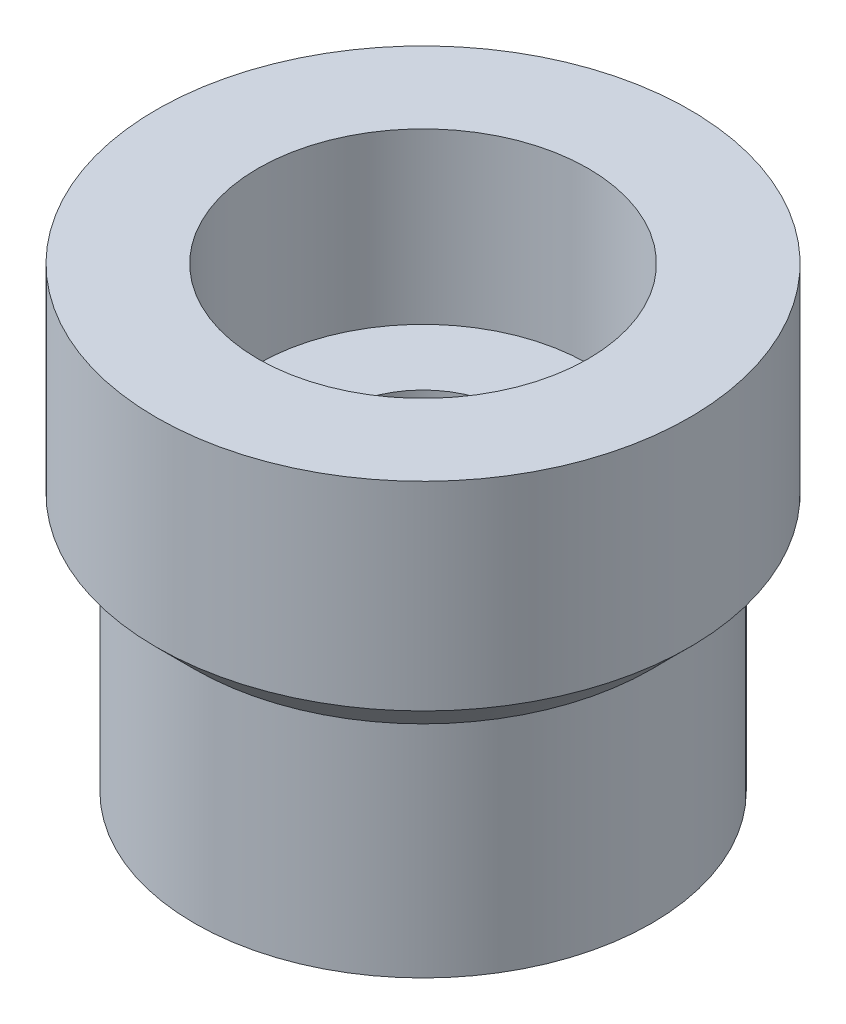
ISO-10303-21;
HEADER;
FILE_DESCRIPTION(('STEP AP214'),'2;1');
FILE_NAME('part.step','',(''),(''),'','','');
FILE_SCHEMA(('AUTOMOTIVE_DESIGN { 1 0 10303 214 1 1 1 1 }'));
ENDSEC;
DATA;
#1=APPLICATION_CONTEXT('core data for automotive mechanical design processes');
#2=APPLICATION_PROTOCOL_DEFINITION('international standard','automotive_design',2000,#1);
#3=PRODUCT_CONTEXT('',#1,'mechanical');
#4=PRODUCT('Part','Part','',(#3));
#5=PRODUCT_RELATED_PRODUCT_CATEGORY('part','',(#4));
#6=PRODUCT_DEFINITION_FORMATION('','',#4);
#7=PRODUCT_DEFINITION_CONTEXT('part definition',#1,'design');
#8=PRODUCT_DEFINITION('design','',#6,#7);
#9=PRODUCT_DEFINITION_SHAPE('','',#8);
#10=(LENGTH_UNIT() NAMED_UNIT(*) SI_UNIT(.MILLI.,.METRE.));
#11=(NAMED_UNIT(*) PLANE_ANGLE_UNIT() SI_UNIT($,.RADIAN.));
#12=(NAMED_UNIT(*) SI_UNIT($,.STERADIAN.) SOLID_ANGLE_UNIT());
#13=UNCERTAINTY_MEASURE_WITH_UNIT(LENGTH_MEASURE(1.E-05),#10,'distance_accuracy_value','');
#14=(GEOMETRIC_REPRESENTATION_CONTEXT(3) GLOBAL_UNCERTAINTY_ASSIGNED_CONTEXT((#13)) GLOBAL_UNIT_ASSIGNED_CONTEXT((#10,
#11,#12)) REPRESENTATION_CONTEXT('',''));
#15=CARTESIAN_POINT('',(0.,0.,0.));
#16=DIRECTION('',(0.,0.,1.));
#17=DIRECTION('',(1.,0.,0.));
#18=AXIS2_PLACEMENT_3D('',#15,#16,#17);
#19=CARTESIAN_POINT('',(0.,3.4,0.));
#20=DIRECTION('',(0.,1.,0.));
#21=DIRECTION('',(0.,0.,1.));
#22=AXIS2_PLACEMENT_3D('',#19,#20,#21);
#23=PLANE('',#22);
#24=CARTESIAN_POINT('',(0.,3.4,0.));
#25=DIRECTION('',(0.,1.,0.));
#26=DIRECTION('',(0.,0.,1.));
#27=AXIS2_PLACEMENT_3D('',#24,#25,#26);
#28=CIRCLE('',#27,1.);
#29=CARTESIAN_POINT('',(0.,3.4,1.));
#30=VERTEX_POINT('',#29);
#31=EDGE_CURVE('E65',#30,#30,#28,.T.);
#32=ORIENTED_EDGE('',*,*,#31,.F.);
#33=EDGE_LOOP('',(#32));
#34=FACE_BOUND('',#33,.T.);
#35=CARTESIAN_POINT('',(0.,3.4,0.));
#36=DIRECTION('',(0.,1.,0.));
#37=DIRECTION('',(0.,0.,1.));
#38=AXIS2_PLACEMENT_3D('',#35,#36,#37);
#39=CIRCLE('',#38,1.95);
#40=CARTESIAN_POINT('',(0.,3.4,1.95));
#41=VERTEX_POINT('',#40);
#42=EDGE_CURVE('E78',#41,#41,#39,.T.);
#43=ORIENTED_EDGE('',*,*,#42,.T.);
#44=EDGE_LOOP('',(#43));
#45=FACE_BOUND('',#44,.T.);
#46=ADVANCED_FACE('F37',(#34,#45),#23,.T.);
#47=CARTESIAN_POINT('',(0.,0.,0.));
#48=DIRECTION('',(0.,1.,0.));
#49=DIRECTION('',(0.,0.,1.));
#50=AXIS2_PLACEMENT_3D('',#47,#48,#49);
#51=PLANE('',#50);
#52=CARTESIAN_POINT('',(0.,0.,0.));
#53=DIRECTION('',(0.,1.,0.));
#54=DIRECTION('',(0.,0.,1.));
#55=AXIS2_PLACEMENT_3D('',#52,#53,#54);
#56=CIRCLE('',#55,2.7);
#57=CARTESIAN_POINT('',(0.,0.,2.7));
#58=VERTEX_POINT('',#57);
#59=EDGE_CURVE('E50',#58,#58,#56,.T.);
#60=ORIENTED_EDGE('',*,*,#59,.F.);
#61=EDGE_LOOP('',(#60));
#62=FACE_BOUND('',#61,.T.);
#63=CARTESIAN_POINT('',(0.,0.,0.));
#64=DIRECTION('',(0.,1.,0.));
#65=DIRECTION('',(0.,0.,1.));
#66=AXIS2_PLACEMENT_3D('',#63,#64,#65);
#67=CIRCLE('',#66,1.5);
#68=CARTESIAN_POINT('',(0.,0.,1.5));
#69=VERTEX_POINT('',#68);
#70=EDGE_CURVE('E55',#69,#69,#67,.T.);
#71=ORIENTED_EDGE('',*,*,#70,.T.);
#72=EDGE_LOOP('',(#71));
#73=FACE_BOUND('',#72,.T.);
#74=ADVANCED_FACE('F105',(#62,#73),#51,.F.);
#75=CARTESIAN_POINT('',(0.,2.6,0.));
#76=DIRECTION('',(0.,-1.,0.));
#77=DIRECTION('',(0.,0.,-1.));
#78=AXIS2_PLACEMENT_3D('',#75,#76,#77);
#79=CYLINDRICAL_SURFACE('',#78,2.7);
#80=CARTESIAN_POINT('',(0.,2.59999999999999,0.));
#81=DIRECTION('',(0.,1.,0.));
#82=DIRECTION('',(0.,0.,1.));
#83=AXIS2_PLACEMENT_3D('',#80,#81,#82);
#84=CIRCLE('',#83,2.7);
#85=CARTESIAN_POINT('',(0.,2.59999999999999,2.7));
#86=VERTEX_POINT('',#85);
#87=EDGE_CURVE('E45',#86,#86,#84,.F.);
#88=ORIENTED_EDGE('',*,*,#87,.T.);
#89=EDGE_LOOP('',(#88));
#90=FACE_BOUND('',#89,.T.);
#91=ORIENTED_EDGE('',*,*,#59,.T.);
#92=EDGE_LOOP('',(#91));
#93=FACE_BOUND('',#92,.T.);
#94=ADVANCED_FACE('F111',(#90,#93),#79,.T.);
#95=CARTESIAN_POINT('',(0.,2.6,0.));
#96=DIRECTION('',(0.,-1.,0.));
#97=DIRECTION('',(0.,0.,-1.));
#98=AXIS2_PLACEMENT_3D('',#95,#96,#97);
#99=CYLINDRICAL_SURFACE('',#98,1.5);
#100=CARTESIAN_POINT('',(0.,2.6,0.));
#101=DIRECTION('',(0.,1.,0.));
#102=DIRECTION('',(0.,0.,1.));
#103=AXIS2_PLACEMENT_3D('',#100,#101,#102);
#104=CIRCLE('',#103,1.5);
#105=CARTESIAN_POINT('',(0.,2.6,1.5));
#106=VERTEX_POINT('',#105);
#107=EDGE_CURVE('E61',#106,#106,#104,.T.);
#108=ORIENTED_EDGE('',*,*,#107,.T.);
#109=EDGE_LOOP('',(#108));
#110=FACE_BOUND('',#109,.T.);
#111=ORIENTED_EDGE('',*,*,#70,.F.);
#112=EDGE_LOOP('',(#111));
#113=FACE_BOUND('',#112,.T.);
#114=ADVANCED_FACE('F119',(#110,#113),#99,.F.);
#115=CARTESIAN_POINT('',(0.,2.6,0.));
#116=DIRECTION('',(0.,1.,0.));
#117=DIRECTION('',(0.,0.,1.));
#118=AXIS2_PLACEMENT_3D('',#115,#116,#117);
#119=PLANE('',#118);
#120=CARTESIAN_POINT('',(0.,2.6,0.));
#121=DIRECTION('',(0.,1.,0.));
#122=DIRECTION('',(0.,0.,1.));
#123=AXIS2_PLACEMENT_3D('',#120,#121,#122);
#124=CIRCLE('',#123,1.);
#125=CARTESIAN_POINT('',(0.,2.6,1.));
#126=VERTEX_POINT('',#125);
#127=EDGE_CURVE('E66',#126,#126,#124,.T.);
#128=ORIENTED_EDGE('',*,*,#127,.T.);
#129=EDGE_LOOP('',(#128));
#130=FACE_BOUND('',#129,.T.);
#131=ORIENTED_EDGE('',*,*,#107,.F.);
#132=EDGE_LOOP('',(#131));
#133=FACE_BOUND('',#132,.T.);
#134=ADVANCED_FACE('F100',(#130,#133),#119,.F.);
#135=CARTESIAN_POINT('',(0.,3.4,0.));
#136=DIRECTION('',(0.,-1.,0.));
#137=DIRECTION('',(0.,0.,-1.));
#138=AXIS2_PLACEMENT_3D('',#135,#136,#137);
#139=CYLINDRICAL_SURFACE('',#138,1.);
#140=ORIENTED_EDGE('',*,*,#31,.T.);
#141=EDGE_LOOP('',(#140));
#142=FACE_BOUND('',#141,.T.);
#143=ORIENTED_EDGE('',*,*,#127,.F.);
#144=EDGE_LOOP('',(#143));
#145=FACE_BOUND('',#144,.T.);
#146=ADVANCED_FACE('F92',(#142,#145),#139,.F.);
#147=CARTESIAN_POINT('',(0.,5.4,0.));
#148=DIRECTION('',(0.,1.,0.));
#149=DIRECTION('',(0.,0.,1.));
#150=AXIS2_PLACEMENT_3D('',#147,#148,#149);
#151=PLANE('',#150);
#152=CARTESIAN_POINT('',(0.,5.4,0.));
#153=DIRECTION('',(0.,1.,0.));
#154=DIRECTION('',(0.,0.,1.));
#155=AXIS2_PLACEMENT_3D('',#152,#153,#154);
#156=CIRCLE('',#155,3.15);
#157=CARTESIAN_POINT('',(0.,5.4,3.15));
#158=VERTEX_POINT('',#157);
#159=EDGE_CURVE('E70',#158,#158,#156,.T.);
#160=ORIENTED_EDGE('',*,*,#159,.T.);
#161=EDGE_LOOP('',(#160));
#162=FACE_BOUND('',#161,.T.);
#163=CARTESIAN_POINT('',(0.,5.4,0.));
#164=DIRECTION('',(0.,1.,0.));
#165=DIRECTION('',(0.,0.,1.));
#166=AXIS2_PLACEMENT_3D('',#163,#164,#165);
#167=CIRCLE('',#166,1.95);
#168=CARTESIAN_POINT('',(0.,5.4,1.95));
#169=VERTEX_POINT('',#168);
#170=EDGE_CURVE('E77',#169,#169,#167,.T.);
#171=ORIENTED_EDGE('',*,*,#170,.F.);
#172=EDGE_LOOP('',(#171));
#173=FACE_BOUND('',#172,.T.);
#174=ADVANCED_FACE('F89',(#162,#173),#151,.T.);
#175=CARTESIAN_POINT('',(0.,5.4,0.));
#176=DIRECTION('',(0.,-1.,0.));
#177=DIRECTION('',(0.,0.,-1.));
#178=AXIS2_PLACEMENT_3D('',#175,#176,#177);
#179=CYLINDRICAL_SURFACE('',#178,3.15);
#180=CARTESIAN_POINT('',(0.,3.04999999999999,0.));
#181=DIRECTION('',(0.,1.,0.));
#182=DIRECTION('',(0.,0.,1.));
#183=AXIS2_PLACEMENT_3D('',#180,#181,#182);
#184=CIRCLE('',#183,3.15);
#185=CARTESIAN_POINT('',(0.,3.04999999999999,3.15));
#186=VERTEX_POINT('',#185);
#187=EDGE_CURVE('E10',#186,#186,#184,.T.);
#188=ORIENTED_EDGE('',*,*,#187,.T.);
#189=EDGE_LOOP('',(#188));
#190=FACE_BOUND('',#189,.T.);
#191=ORIENTED_EDGE('',*,*,#159,.F.);
#192=EDGE_LOOP('',(#191));
#193=FACE_BOUND('',#192,.T.);
#194=ADVANCED_FACE('F91',(#190,#193),#179,.T.);
#195=CARTESIAN_POINT('',(0.,5.4,0.));
#196=DIRECTION('',(0.,-1.,0.));
#197=DIRECTION('',(0.,0.,-1.));
#198=AXIS2_PLACEMENT_3D('',#195,#196,#197);
#199=CYLINDRICAL_SURFACE('',#198,1.95);
#200=ORIENTED_EDGE('',*,*,#170,.T.);
#201=EDGE_LOOP('',(#200));
#202=FACE_BOUND('',#201,.T.);
#203=ORIENTED_EDGE('',*,*,#42,.F.);
#204=EDGE_LOOP('',(#203));
#205=FACE_BOUND('',#204,.T.);
#206=ADVANCED_FACE('F86',(#202,#205),#199,.F.);
#207=CARTESIAN_POINT('',(0.,3.4,0.));
#208=DIRECTION('',(0.,1.,0.));
#209=DIRECTION('',(0.,0.,1.));
#210=AXIS2_PLACEMENT_3D('',#207,#208,#209);
#211=CONICAL_SURFACE('',#210,3.50000000000001,0.785398163397454);
#212=ORIENTED_EDGE('',*,*,#87,.F.);
#213=EDGE_LOOP('',(#212));
#214=FACE_BOUND('',#213,.T.);
#215=ORIENTED_EDGE('',*,*,#187,.F.);
#216=EDGE_LOOP('',(#215));
#217=FACE_BOUND('',#216,.T.);
#218=ADVANCED_FACE('F39',(#214,#217),#211,.T.);
#219=CLOSED_SHELL('',(#46,#74,#94,#114,#134,#146,#174,#194,#206,#218));
#220=MANIFOLD_SOLID_BREP('B2',#219);
#221=ADVANCED_BREP_SHAPE_REPRESENTATION('',(#18,#220),#14);
#222=SHAPE_DEFINITION_REPRESENTATION(#9,#221);
ENDSEC;
END-ISO-10303-21;
